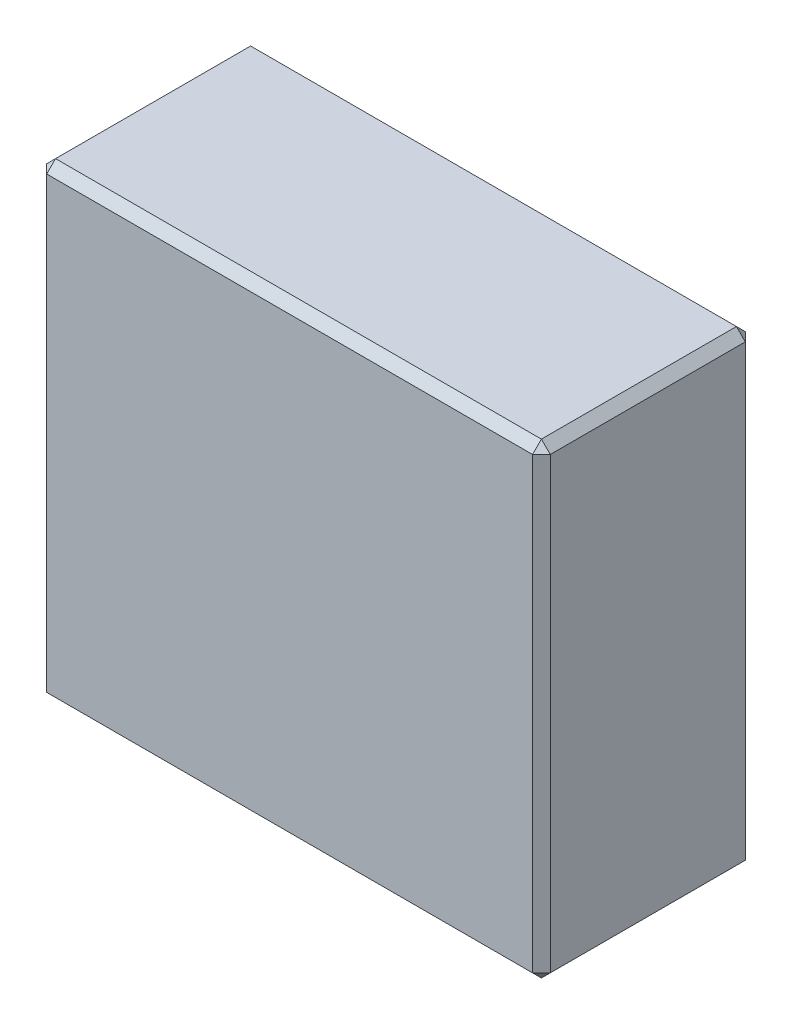
ISO-10303-21;
HEADER;
FILE_DESCRIPTION(('STEP AP214'),'2;1');
FILE_NAME('part.step','',(''),(''),'','','');
FILE_SCHEMA(('AUTOMOTIVE_DESIGN { 1 0 10303 214 1 1 1 1 }'));
ENDSEC;
DATA;
#1=APPLICATION_CONTEXT('core data for automotive mechanical design processes');
#2=APPLICATION_PROTOCOL_DEFINITION('international standard','automotive_design',2000,#1);
#3=PRODUCT_CONTEXT('',#1,'mechanical');
#4=PRODUCT('Part','Part','',(#3));
#5=PRODUCT_RELATED_PRODUCT_CATEGORY('part','',(#4));
#6=PRODUCT_DEFINITION_FORMATION('','',#4);
#7=PRODUCT_DEFINITION_CONTEXT('part definition',#1,'design');
#8=PRODUCT_DEFINITION('design','',#6,#7);
#9=PRODUCT_DEFINITION_SHAPE('','',#8);
#10=(LENGTH_UNIT() NAMED_UNIT(*) SI_UNIT(.MILLI.,.METRE.));
#11=(NAMED_UNIT(*) PLANE_ANGLE_UNIT() SI_UNIT($,.RADIAN.));
#12=(NAMED_UNIT(*) SI_UNIT($,.STERADIAN.) SOLID_ANGLE_UNIT());
#13=UNCERTAINTY_MEASURE_WITH_UNIT(LENGTH_MEASURE(1.E-05),#10,'distance_accuracy_value','');
#14=(GEOMETRIC_REPRESENTATION_CONTEXT(3) GLOBAL_UNCERTAINTY_ASSIGNED_CONTEXT((#13)) GLOBAL_UNIT_ASSIGNED_CONTEXT((#10,
#11,#12)) REPRESENTATION_CONTEXT('',''));
#15=CARTESIAN_POINT('',(0.,0.,0.));
#16=DIRECTION('',(0.,0.,1.));
#17=DIRECTION('',(1.,0.,0.));
#18=AXIS2_PLACEMENT_3D('',#15,#16,#17);
#19=CARTESIAN_POINT('',(-90.17,-83.566,38.1));
#20=DIRECTION('',(-1.,0.,0.));
#21=DIRECTION('',(0.,0.,1.));
#22=AXIS2_PLACEMENT_3D('',#19,#20,#21);
#23=PLANE('',#22);
#24=DIRECTION('',(0.,-1.,0.));
#25=VECTOR('',#24,1.);
#26=CARTESIAN_POINT('',(-90.17,-83.566,-34.9249999999999));
#27=LINE('',#26,#25);
#28=CARTESIAN_POINT('',(-90.17,80.3909999999999,-34.9249999999999));
#29=VERTEX_POINT('',#28);
#30=CARTESIAN_POINT('',(-90.17,-80.3909999999999,-34.9249999999999));
#31=VERTEX_POINT('',#30);
#32=EDGE_CURVE('E284',#29,#31,#27,.T.);
#33=ORIENTED_EDGE('',*,*,#32,.T.);
#34=DIRECTION('',(0.,0.,1.));
#35=VECTOR('',#34,1.);
#36=CARTESIAN_POINT('',(-90.17,-80.3909999999999,38.1));
#37=LINE('',#36,#35);
#38=CARTESIAN_POINT('',(-90.17,-80.3909999999999,34.9249999999999));
#39=VERTEX_POINT('',#38);
#40=EDGE_CURVE('E223',#31,#39,#37,.T.);
#41=ORIENTED_EDGE('',*,*,#40,.T.);
#42=DIRECTION('',(0.,1.,0.));
#43=VECTOR('',#42,1.);
#44=CARTESIAN_POINT('',(-90.17,-83.566,34.9249999999999));
#45=LINE('',#44,#43);
#46=CARTESIAN_POINT('',(-90.17,80.3909999999999,34.9249999999999));
#47=VERTEX_POINT('',#46);
#48=EDGE_CURVE('E213',#39,#47,#45,.T.);
#49=ORIENTED_EDGE('',*,*,#48,.T.);
#50=DIRECTION('',(0.,0.,-1.));
#51=VECTOR('',#50,1.);
#52=CARTESIAN_POINT('',(-90.17,80.3909999999999,38.1));
#53=LINE('',#52,#51);
#54=EDGE_CURVE('E281',#47,#29,#53,.T.);
#55=ORIENTED_EDGE('',*,*,#54,.T.);
#56=EDGE_LOOP('',(#33,#41,#49,#55));
#57=FACE_BOUND('',#56,.T.);
#58=ADVANCED_FACE('F36',(#57),#23,.T.);
#59=CARTESIAN_POINT('',(90.17,-83.566,-38.1));
#60=DIRECTION('',(0.,0.,-1.));
#61=DIRECTION('',(-1.,0.,0.));
#62=AXIS2_PLACEMENT_3D('',#59,#60,#61);
#63=PLANE('',#62);
#64=DIRECTION('',(0.,-1.,0.));
#65=VECTOR('',#64,1.);
#66=CARTESIAN_POINT('',(86.9949999999999,-83.566,-38.1));
#67=LINE('',#66,#65);
#68=CARTESIAN_POINT('',(86.9949999999999,80.3909999999999,-38.1));
#69=VERTEX_POINT('',#68);
#70=CARTESIAN_POINT('',(86.9949999999999,-80.3909999999999,-38.1));
#71=VERTEX_POINT('',#70);
#72=EDGE_CURVE('E155',#69,#71,#67,.T.);
#73=ORIENTED_EDGE('',*,*,#72,.T.);
#74=DIRECTION('',(-1.,0.,0.));
#75=VECTOR('',#74,1.);
#76=CARTESIAN_POINT('',(-90.17,-80.3909999999999,-38.1));
#77=LINE('',#76,#75);
#78=CARTESIAN_POINT('',(-86.9949999999999,-80.3909999999999,-38.1));
#79=VERTEX_POINT('',#78);
#80=EDGE_CURVE('E278',#71,#79,#77,.T.);
#81=ORIENTED_EDGE('',*,*,#80,.T.);
#82=DIRECTION('',(0.,1.,0.));
#83=VECTOR('',#82,1.);
#84=CARTESIAN_POINT('',(-86.9949999999999,-83.566,-38.1));
#85=LINE('',#84,#83);
#86=CARTESIAN_POINT('',(-86.9949999999999,80.3909999999999,-38.1));
#87=VERTEX_POINT('',#86);
#88=EDGE_CURVE('E271',#79,#87,#85,.T.);
#89=ORIENTED_EDGE('',*,*,#88,.T.);
#90=DIRECTION('',(1.,0.,0.));
#91=VECTOR('',#90,1.);
#92=CARTESIAN_POINT('',(90.17,80.3909999999999,-38.1));
#93=LINE('',#92,#91);
#94=EDGE_CURVE('E269',#87,#69,#93,.T.);
#95=ORIENTED_EDGE('',*,*,#94,.T.);
#96=EDGE_LOOP('',(#73,#81,#89,#95));
#97=FACE_BOUND('',#96,.T.);
#98=ADVANCED_FACE('F331',(#97),#63,.T.);
#99=CARTESIAN_POINT('',(90.17,-83.566,38.1));
#100=DIRECTION('',(1.,0.,0.));
#101=DIRECTION('',(0.,0.,-1.));
#102=AXIS2_PLACEMENT_3D('',#99,#100,#101);
#103=PLANE('',#102);
#104=DIRECTION('',(0.,-1.,0.));
#105=VECTOR('',#104,1.);
#106=CARTESIAN_POINT('',(90.17,-83.566,34.9249999999999));
#107=LINE('',#106,#105);
#108=CARTESIAN_POINT('',(90.17,80.3909999999999,34.9249999999999));
#109=VERTEX_POINT('',#108);
#110=CARTESIAN_POINT('',(90.17,-80.3909999999999,34.9249999999999));
#111=VERTEX_POINT('',#110);
#112=EDGE_CURVE('E134',#109,#111,#107,.T.);
#113=ORIENTED_EDGE('',*,*,#112,.T.);
#114=DIRECTION('',(0.,0.,-1.));
#115=VECTOR('',#114,1.);
#116=CARTESIAN_POINT('',(90.17,-80.3909999999999,-38.1));
#117=LINE('',#116,#115);
#118=CARTESIAN_POINT('',(90.17,-80.3909999999999,-34.9249999999999));
#119=VERTEX_POINT('',#118);
#120=EDGE_CURVE('E130',#111,#119,#117,.T.);
#121=ORIENTED_EDGE('',*,*,#120,.T.);
#122=DIRECTION('',(0.,1.,0.));
#123=VECTOR('',#122,1.);
#124=CARTESIAN_POINT('',(90.17,-83.566,-34.9249999999999));
#125=LINE('',#124,#123);
#126=CARTESIAN_POINT('',(90.17,80.3909999999999,-34.9249999999999));
#127=VERTEX_POINT('',#126);
#128=EDGE_CURVE('E124',#119,#127,#125,.T.);
#129=ORIENTED_EDGE('',*,*,#128,.T.);
#130=DIRECTION('',(0.,0.,1.));
#131=VECTOR('',#130,1.);
#132=CARTESIAN_POINT('',(90.17,80.3909999999999,38.1));
#133=LINE('',#132,#131);
#134=EDGE_CURVE('E127',#127,#109,#133,.T.);
#135=ORIENTED_EDGE('',*,*,#134,.T.);
#136=EDGE_LOOP('',(#113,#121,#129,#135));
#137=FACE_BOUND('',#136,.T.);
#138=ADVANCED_FACE('F126',(#137),#103,.T.);
#139=CARTESIAN_POINT('',(90.17,-83.566,38.1));
#140=DIRECTION('',(0.,0.,1.));
#141=DIRECTION('',(1.,0.,0.));
#142=AXIS2_PLACEMENT_3D('',#139,#140,#141);
#143=PLANE('',#142);
#144=DIRECTION('',(1.,0.,0.));
#145=VECTOR('',#144,1.);
#146=CARTESIAN_POINT('',(90.17,-80.3909999999999,38.1));
#147=LINE('',#146,#145);
#148=CARTESIAN_POINT('',(-86.9949999999999,-80.3909999999999,38.1));
#149=VERTEX_POINT('',#148);
#150=CARTESIAN_POINT('',(86.9949999999999,-80.3909999999999,38.1));
#151=VERTEX_POINT('',#150);
#152=EDGE_CURVE('E218',#149,#151,#147,.T.);
#153=ORIENTED_EDGE('',*,*,#152,.T.);
#154=DIRECTION('',(0.,1.,0.));
#155=VECTOR('',#154,1.);
#156=CARTESIAN_POINT('',(86.9949999999999,-83.566,38.1));
#157=LINE('',#156,#155);
#158=CARTESIAN_POINT('',(86.9949999999999,80.3909999999999,38.1));
#159=VERTEX_POINT('',#158);
#160=EDGE_CURVE('E221',#151,#159,#157,.T.);
#161=ORIENTED_EDGE('',*,*,#160,.T.);
#162=DIRECTION('',(-1.,0.,0.));
#163=VECTOR('',#162,1.);
#164=CARTESIAN_POINT('',(90.17,80.3909999999999,38.1));
#165=LINE('',#164,#163);
#166=CARTESIAN_POINT('',(-86.9949999999999,80.3909999999999,38.1));
#167=VERTEX_POINT('',#166);
#168=EDGE_CURVE('E219',#159,#167,#165,.T.);
#169=ORIENTED_EDGE('',*,*,#168,.T.);
#170=DIRECTION('',(0.,-1.,0.));
#171=VECTOR('',#170,1.);
#172=CARTESIAN_POINT('',(-86.9949999999999,-83.566,38.1));
#173=LINE('',#172,#171);
#174=EDGE_CURVE('E215',#167,#149,#173,.T.);
#175=ORIENTED_EDGE('',*,*,#174,.T.);
#176=EDGE_LOOP('',(#153,#161,#169,#175));
#177=FACE_BOUND('',#176,.T.);
#178=ADVANCED_FACE('F310',(#177),#143,.T.);
#179=CARTESIAN_POINT('',(0.,-83.566,0.));
#180=DIRECTION('',(0.,1.,0.));
#181=DIRECTION('',(0.,0.,1.));
#182=AXIS2_PLACEMENT_3D('',#179,#180,#181);
#183=PLANE('',#182);
#184=DIRECTION('',(1.,0.,0.));
#185=VECTOR('',#184,1.);
#186=CARTESIAN_POINT('',(90.17,-83.566,-34.9249999999999));
#187=LINE('',#186,#185);
#188=CARTESIAN_POINT('',(-86.9949999999999,-83.566,-34.9249999999999));
#189=VERTEX_POINT('',#188);
#190=CARTESIAN_POINT('',(86.9949999999999,-83.566,-34.9249999999999));
#191=VERTEX_POINT('',#190);
#192=EDGE_CURVE('E265',#189,#191,#187,.T.);
#193=ORIENTED_EDGE('',*,*,#192,.T.);
#194=DIRECTION('',(0.,0.,1.));
#195=VECTOR('',#194,1.);
#196=CARTESIAN_POINT('',(86.9949999999999,-83.566,38.1));
#197=LINE('',#196,#195);
#198=CARTESIAN_POINT('',(86.9949999999999,-83.566,34.9249999999999));
#199=VERTEX_POINT('',#198);
#200=EDGE_CURVE('E262',#191,#199,#197,.T.);
#201=ORIENTED_EDGE('',*,*,#200,.T.);
#202=DIRECTION('',(-1.,0.,0.));
#203=VECTOR('',#202,1.);
#204=CARTESIAN_POINT('',(-90.17,-83.566,34.9249999999999));
#205=LINE('',#204,#203);
#206=CARTESIAN_POINT('',(-86.9949999999999,-83.566,34.9249999999999));
#207=VERTEX_POINT('',#206);
#208=EDGE_CURVE('E254',#199,#207,#205,.T.);
#209=ORIENTED_EDGE('',*,*,#208,.T.);
#210=DIRECTION('',(0.,0.,-1.));
#211=VECTOR('',#210,1.);
#212=CARTESIAN_POINT('',(-86.9949999999999,-83.566,-38.1));
#213=LINE('',#212,#211);
#214=EDGE_CURVE('E259',#207,#189,#213,.T.);
#215=ORIENTED_EDGE('',*,*,#214,.T.);
#216=EDGE_LOOP('',(#193,#201,#209,#215));
#217=FACE_BOUND('',#216,.T.);
#218=ADVANCED_FACE('F263',(#217),#183,.F.);
#219=CARTESIAN_POINT('',(0.,83.566,0.));
#220=DIRECTION('',(0.,1.,0.));
#221=DIRECTION('',(0.,0.,1.));
#222=AXIS2_PLACEMENT_3D('',#219,#220,#221);
#223=PLANE('',#222);
#224=DIRECTION('',(0.,0.,-1.));
#225=VECTOR('',#224,1.);
#226=CARTESIAN_POINT('',(86.9949999999999,83.566,0.));
#227=LINE('',#226,#225);
#228=CARTESIAN_POINT('',(86.9949999999999,83.566,34.9249999999999));
#229=VERTEX_POINT('',#228);
#230=CARTESIAN_POINT('',(86.9949999999999,83.566,-34.9249999999999));
#231=VERTEX_POINT('',#230);
#232=EDGE_CURVE('E45',#229,#231,#227,.T.);
#233=ORIENTED_EDGE('',*,*,#232,.T.);
#234=DIRECTION('',(-1.,0.,0.));
#235=VECTOR('',#234,1.);
#236=CARTESIAN_POINT('',(0.,83.566,-34.9249999999999));
#237=LINE('',#236,#235);
#238=CARTESIAN_POINT('',(-86.9949999999999,83.566,-34.9249999999999));
#239=VERTEX_POINT('',#238);
#240=EDGE_CURVE('E11',#231,#239,#237,.T.);
#241=ORIENTED_EDGE('',*,*,#240,.T.);
#242=DIRECTION('',(0.,0.,1.));
#243=VECTOR('',#242,1.);
#244=CARTESIAN_POINT('',(-86.9949999999999,83.566,0.));
#245=LINE('',#244,#243);
#246=CARTESIAN_POINT('',(-86.9949999999999,83.566,34.9249999999999));
#247=VERTEX_POINT('',#246);
#248=EDGE_CURVE('E229',#239,#247,#245,.T.);
#249=ORIENTED_EDGE('',*,*,#248,.T.);
#250=DIRECTION('',(1.,0.,0.));
#251=VECTOR('',#250,1.);
#252=CARTESIAN_POINT('',(0.,83.566,34.9249999999999));
#253=LINE('',#252,#251);
#254=EDGE_CURVE('E56',#247,#229,#253,.T.);
#255=ORIENTED_EDGE('',*,*,#254,.T.);
#256=EDGE_LOOP('',(#233,#241,#249,#255));
#257=FACE_BOUND('',#256,.T.);
#258=ADVANCED_FACE('F380',(#257),#223,.T.);
#259=CARTESIAN_POINT('',(-86.9949999999999,83.566,0.));
#260=DIRECTION('',(0.707106781186551,-0.707106781186544,0.));
#261=DIRECTION('',(0.,0.,1.));
#262=AXIS2_PLACEMENT_3D('',#259,#260,#261);
#263=PLANE('',#262);
#264=DIRECTION('',(0.707106781186544,0.707106781186551,0.));
#265=VECTOR('',#264,1.);
#266=CARTESIAN_POINT('',(-90.17,80.3909999999999,34.9249999999999));
#267=LINE('',#266,#265);
#268=EDGE_CURVE('E40',#247,#47,#267,.F.);
#269=ORIENTED_EDGE('',*,*,#268,.F.);
#270=ORIENTED_EDGE('',*,*,#248,.F.);
#271=DIRECTION('',(-0.707106781186544,-0.707106781186551,0.));
#272=VECTOR('',#271,1.);
#273=CARTESIAN_POINT('',(-88.5825,81.9785,-34.9249999999999));
#274=LINE('',#273,#272);
#275=EDGE_CURVE('E193',#29,#239,#274,.F.);
#276=ORIENTED_EDGE('',*,*,#275,.F.);
#277=ORIENTED_EDGE('',*,*,#54,.F.);
#278=EDGE_LOOP('',(#269,#270,#276,#277));
#279=FACE_BOUND('',#278,.T.);
#280=ADVANCED_FACE('F38',(#279),#263,.F.);
#281=CARTESIAN_POINT('',(-90.17,80.3909999999999,34.9249999999999));
#282=DIRECTION('',(-0.577350269189631,0.577350269189621,0.577350269189626));
#283=DIRECTION('',(0.707106781186544,0.,0.707106781186551));
#284=AXIS2_PLACEMENT_3D('',#281,#282,#283);
#285=PLANE('',#284);
#286=DIRECTION('',(0.,-0.707106781186551,0.707106781186544));
#287=VECTOR('',#286,1.);
#288=CARTESIAN_POINT('',(-86.9949999999999,81.9785,36.5124999999999));
#289=LINE('',#288,#287);
#290=EDGE_CURVE('E188',#247,#167,#289,.T.);
#291=ORIENTED_EDGE('',*,*,#290,.F.);
#292=ORIENTED_EDGE('',*,*,#268,.T.);
#293=DIRECTION('',(-0.707106781186544,0.,-0.707106781186551));
#294=VECTOR('',#293,1.);
#295=CARTESIAN_POINT('',(-90.17,80.3909999999999,34.9249999999999));
#296=LINE('',#295,#294);
#297=EDGE_CURVE('E191',#167,#47,#296,.T.);
#298=ORIENTED_EDGE('',*,*,#297,.F.);
#299=EDGE_LOOP('',(#291,#292,#298));
#300=FACE_BOUND('',#299,.T.);
#301=ADVANCED_FACE('F205',(#300),#285,.T.);
#302=CARTESIAN_POINT('',(-86.9949999999999,80.3909999999999,-38.1));
#303=DIRECTION('',(-0.577350269189631,0.577350269189621,-0.577350269189626));
#304=DIRECTION('',(-0.707106781186544,0.,0.707106781186551));
#305=AXIS2_PLACEMENT_3D('',#302,#303,#304);
#306=PLANE('',#305);
#307=DIRECTION('',(0.707106781186544,0.,-0.707106781186551));
#308=VECTOR('',#307,1.);
#309=CARTESIAN_POINT('',(-86.9949999999999,80.3909999999999,-38.1));
#310=LINE('',#309,#308);
#311=EDGE_CURVE('E183',#29,#87,#310,.T.);
#312=ORIENTED_EDGE('',*,*,#311,.F.);
#313=ORIENTED_EDGE('',*,*,#275,.T.);
#314=DIRECTION('',(0.,0.707106781186551,0.707106781186544));
#315=VECTOR('',#314,1.);
#316=CARTESIAN_POINT('',(-86.9949999999999,80.3909999999999,-38.1));
#317=LINE('',#316,#315);
#318=EDGE_CURVE('E186',#87,#239,#317,.T.);
#319=ORIENTED_EDGE('',*,*,#318,.F.);
#320=EDGE_LOOP('',(#312,#313,#319));
#321=FACE_BOUND('',#320,.T.);
#322=ADVANCED_FACE('F328',(#321),#306,.T.);
#323=CARTESIAN_POINT('',(-90.17,-83.566,34.9249999999999));
#324=DIRECTION('',(0.707106781186551,0.,-0.707106781186544));
#325=DIRECTION('',(0.,1.,0.));
#326=AXIS2_PLACEMENT_3D('',#323,#324,#325);
#327=PLANE('',#326);
#328=ORIENTED_EDGE('',*,*,#297,.T.);
#329=ORIENTED_EDGE('',*,*,#48,.F.);
#330=DIRECTION('',(0.707106781186544,0.,0.707106781186551));
#331=VECTOR('',#330,1.);
#332=CARTESIAN_POINT('',(-90.17,-80.3909999999999,34.9249999999999));
#333=LINE('',#332,#331);
#334=EDGE_CURVE('E178',#149,#39,#333,.F.);
#335=ORIENTED_EDGE('',*,*,#334,.F.);
#336=ORIENTED_EDGE('',*,*,#174,.F.);
#337=EDGE_LOOP('',(#328,#329,#335,#336));
#338=FACE_BOUND('',#337,.T.);
#339=ADVANCED_FACE('F211',(#338),#327,.F.);
#340=CARTESIAN_POINT('',(0.,83.566,34.9249999999999));
#341=DIRECTION('',(0.,-0.707106781186544,-0.707106781186551));
#342=DIRECTION('',(1.,0.,0.));
#343=AXIS2_PLACEMENT_3D('',#340,#341,#342);
#344=PLANE('',#343);
#345=ORIENTED_EDGE('',*,*,#290,.T.);
#346=ORIENTED_EDGE('',*,*,#168,.F.);
#347=DIRECTION('',(0.,0.707106781186551,-0.707106781186544));
#348=VECTOR('',#347,1.);
#349=CARTESIAN_POINT('',(86.9949999999999,80.3909999999999,38.1));
#350=LINE('',#349,#348);
#351=EDGE_CURVE('E175',#229,#159,#350,.F.);
#352=ORIENTED_EDGE('',*,*,#351,.F.);
#353=ORIENTED_EDGE('',*,*,#254,.F.);
#354=EDGE_LOOP('',(#345,#346,#352,#353));
#355=FACE_BOUND('',#354,.T.);
#356=ADVANCED_FACE('F319',(#355),#344,.F.);
#357=CARTESIAN_POINT('',(86.9949999999999,83.566,0.));
#358=DIRECTION('',(-0.707106781186551,-0.707106781186544,0.));
#359=DIRECTION('',(0.,0.,-1.));
#360=AXIS2_PLACEMENT_3D('',#357,#358,#359);
#361=PLANE('',#360);
#362=DIRECTION('',(-0.707106781186544,0.707106781186551,0.));
#363=VECTOR('',#362,1.);
#364=CARTESIAN_POINT('',(90.17,80.3909999999999,-34.9249999999999));
#365=LINE('',#364,#363);
#366=EDGE_CURVE('E140',#231,#127,#365,.F.);
#367=ORIENTED_EDGE('',*,*,#366,.F.);
#368=ORIENTED_EDGE('',*,*,#232,.F.);
#369=DIRECTION('',(0.707106781186544,-0.707106781186551,0.));
#370=VECTOR('',#369,1.);
#371=CARTESIAN_POINT('',(88.5824999999999,81.9785,34.9249999999999));
#372=LINE('',#371,#370);
#373=EDGE_CURVE('E143',#109,#229,#372,.F.);
#374=ORIENTED_EDGE('',*,*,#373,.F.);
#375=ORIENTED_EDGE('',*,*,#134,.F.);
#376=EDGE_LOOP('',(#367,#368,#374,#375));
#377=FACE_BOUND('',#376,.T.);
#378=ADVANCED_FACE('F139',(#377),#361,.F.);
#379=CARTESIAN_POINT('',(0.,83.566,-34.9249999999999));
#380=DIRECTION('',(0.,-0.707106781186544,0.707106781186551));
#381=DIRECTION('',(-1.,0.,0.));
#382=AXIS2_PLACEMENT_3D('',#379,#380,#381);
#383=PLANE('',#382);
#384=ORIENTED_EDGE('',*,*,#318,.T.);
#385=ORIENTED_EDGE('',*,*,#240,.F.);
#386=DIRECTION('',(0.,-0.707106781186551,-0.707106781186544));
#387=VECTOR('',#386,1.);
#388=CARTESIAN_POINT('',(86.9949999999999,81.9785,-36.5124999999999));
#389=LINE('',#388,#387);
#390=EDGE_CURVE('E152',#69,#231,#389,.F.);
#391=ORIENTED_EDGE('',*,*,#390,.F.);
#392=ORIENTED_EDGE('',*,*,#94,.F.);
#393=EDGE_LOOP('',(#384,#385,#391,#392));
#394=FACE_BOUND('',#393,.T.);
#395=ADVANCED_FACE('F326',(#394),#383,.F.);
#396=CARTESIAN_POINT('',(-86.9949999999999,-83.566,-38.1));
#397=DIRECTION('',(0.707106781186551,0.,0.707106781186544));
#398=DIRECTION('',(0.,1.,0.));
#399=AXIS2_PLACEMENT_3D('',#396,#397,#398);
#400=PLANE('',#399);
#401=ORIENTED_EDGE('',*,*,#311,.T.);
#402=ORIENTED_EDGE('',*,*,#88,.F.);
#403=DIRECTION('',(-0.707106781186544,0.,0.707106781186551));
#404=VECTOR('',#403,1.);
#405=CARTESIAN_POINT('',(-86.9949999999999,-80.3909999999999,-38.1));
#406=LINE('',#405,#404);
#407=EDGE_CURVE('E170',#31,#79,#406,.F.);
#408=ORIENTED_EDGE('',*,*,#407,.F.);
#409=ORIENTED_EDGE('',*,*,#32,.F.);
#410=EDGE_LOOP('',(#401,#402,#408,#409));
#411=FACE_BOUND('',#410,.T.);
#412=ADVANCED_FACE('F296',(#411),#400,.F.);
#413=CARTESIAN_POINT('',(-90.17,-80.3909999999999,38.1));
#414=DIRECTION('',(-0.707106781186551,-0.707106781186544,0.));
#415=DIRECTION('',(0.,0.,-1.));
#416=AXIS2_PLACEMENT_3D('',#413,#414,#415);
#417=PLANE('',#416);
#418=DIRECTION('',(0.707106781186544,-0.707106781186551,0.));
#419=VECTOR('',#418,1.);
#420=CARTESIAN_POINT('',(-90.17,-80.3909999999999,34.9249999999999));
#421=LINE('',#420,#419);
#422=EDGE_CURVE('E180',#39,#207,#421,.T.);
#423=ORIENTED_EDGE('',*,*,#422,.F.);
#424=ORIENTED_EDGE('',*,*,#40,.F.);
#425=DIRECTION('',(-0.707106781186544,0.707106781186551,0.));
#426=VECTOR('',#425,1.);
#427=CARTESIAN_POINT('',(-88.5825,-81.9785,-34.9249999999999));
#428=LINE('',#427,#426);
#429=EDGE_CURVE('E167',#189,#31,#428,.T.);
#430=ORIENTED_EDGE('',*,*,#429,.F.);
#431=ORIENTED_EDGE('',*,*,#214,.F.);
#432=EDGE_LOOP('',(#423,#424,#430,#431));
#433=FACE_BOUND('',#432,.T.);
#434=ADVANCED_FACE('F292',(#433),#417,.T.);
#435=CARTESIAN_POINT('',(-90.17,-80.3909999999999,34.9249999999999));
#436=DIRECTION('',(-0.577350269189631,-0.577350269189626,0.577350269189621));
#437=DIRECTION('',(0.707106781186544,-0.707106781186551,0.));
#438=AXIS2_PLACEMENT_3D('',#435,#436,#437);
#439=PLANE('',#438);
#440=ORIENTED_EDGE('',*,*,#334,.T.);
#441=ORIENTED_EDGE('',*,*,#422,.T.);
#442=DIRECTION('',(0.,0.707106781186544,0.707106781186551));
#443=VECTOR('',#442,1.);
#444=CARTESIAN_POINT('',(-86.9949999999999,-81.9785,36.5124999999999));
#445=LINE('',#444,#443);
#446=EDGE_CURVE('E159',#149,#207,#445,.F.);
#447=ORIENTED_EDGE('',*,*,#446,.F.);
#448=EDGE_LOOP('',(#440,#441,#447));
#449=FACE_BOUND('',#448,.T.);
#450=ADVANCED_FACE('F308',(#449),#439,.T.);
#451=CARTESIAN_POINT('',(86.9949999999999,80.3909999999999,38.1));
#452=DIRECTION('',(0.577350269189631,0.577350269189621,0.577350269189626));
#453=DIRECTION('',(0.707106781186544,0.,-0.707106781186551));
#454=AXIS2_PLACEMENT_3D('',#451,#452,#453);
#455=PLANE('',#454);
#456=ORIENTED_EDGE('',*,*,#373,.T.);
#457=ORIENTED_EDGE('',*,*,#351,.T.);
#458=DIRECTION('',(-0.707106781186544,0.,0.707106781186551));
#459=VECTOR('',#458,1.);
#460=CARTESIAN_POINT('',(86.9949999999999,80.3909999999999,38.1));
#461=LINE('',#460,#459);
#462=EDGE_CURVE('E156',#109,#159,#461,.T.);
#463=ORIENTED_EDGE('',*,*,#462,.F.);
#464=EDGE_LOOP('',(#456,#457,#463));
#465=FACE_BOUND('',#464,.T.);
#466=ADVANCED_FACE('F317',(#465),#455,.T.);
#467=CARTESIAN_POINT('',(90.17,80.3909999999999,-34.9249999999999));
#468=DIRECTION('',(0.577350269189626,0.577350269189621,-0.577350269189631));
#469=DIRECTION('',(-0.707106781186551,0.,-0.707106781186544));
#470=AXIS2_PLACEMENT_3D('',#467,#468,#469);
#471=PLANE('',#470);
#472=ORIENTED_EDGE('',*,*,#390,.T.);
#473=ORIENTED_EDGE('',*,*,#366,.T.);
#474=DIRECTION('',(0.707106781186551,0.,0.707106781186544));
#475=VECTOR('',#474,1.);
#476=CARTESIAN_POINT('',(90.17,80.3909999999999,-34.9249999999999));
#477=LINE('',#476,#475);
#478=EDGE_CURVE('E149',#69,#127,#477,.T.);
#479=ORIENTED_EDGE('',*,*,#478,.F.);
#480=EDGE_LOOP('',(#472,#473,#479));
#481=FACE_BOUND('',#480,.T.);
#482=ADVANCED_FACE('F148',(#481),#471,.T.);
#483=CARTESIAN_POINT('',(-86.9949999999999,-80.3909999999999,-38.1));
#484=DIRECTION('',(-0.577350269189631,-0.577350269189626,-0.577350269189621));
#485=DIRECTION('',(0.707106781186544,-0.707106781186551,0.));
#486=AXIS2_PLACEMENT_3D('',#483,#484,#485);
#487=PLANE('',#486);
#488=ORIENTED_EDGE('',*,*,#429,.T.);
#489=ORIENTED_EDGE('',*,*,#407,.T.);
#490=DIRECTION('',(0.,-0.707106781186544,0.707106781186551));
#491=VECTOR('',#490,1.);
#492=CARTESIAN_POINT('',(-86.9949999999999,-80.3909999999999,-38.1));
#493=LINE('',#492,#491);
#494=EDGE_CURVE('E157',#189,#79,#493,.F.);
#495=ORIENTED_EDGE('',*,*,#494,.F.);
#496=EDGE_LOOP('',(#488,#489,#495));
#497=FACE_BOUND('',#496,.T.);
#498=ADVANCED_FACE('F298',(#497),#487,.T.);
#499=CARTESIAN_POINT('',(90.17,-80.3909999999999,38.1));
#500=DIRECTION('',(0.,-0.707106781186551,0.707106781186544));
#501=DIRECTION('',(-1.,0.,0.));
#502=AXIS2_PLACEMENT_3D('',#499,#500,#501);
#503=PLANE('',#502);
#504=ORIENTED_EDGE('',*,*,#446,.T.);
#505=ORIENTED_EDGE('',*,*,#208,.F.);
#506=DIRECTION('',(0.,-0.707106781186544,-0.707106781186551));
#507=VECTOR('',#506,1.);
#508=CARTESIAN_POINT('',(86.9949999999999,-83.566,34.9249999999999));
#509=LINE('',#508,#507);
#510=EDGE_CURVE('E161',#151,#199,#509,.T.);
#511=ORIENTED_EDGE('',*,*,#510,.F.);
#512=ORIENTED_EDGE('',*,*,#152,.F.);
#513=EDGE_LOOP('',(#504,#505,#511,#512));
#514=FACE_BOUND('',#513,.T.);
#515=ADVANCED_FACE('F256',(#514),#503,.T.);
#516=CARTESIAN_POINT('',(86.9949999999999,-83.566,38.1));
#517=DIRECTION('',(-0.707106781186551,0.,-0.707106781186544));
#518=DIRECTION('',(0.,1.,0.));
#519=AXIS2_PLACEMENT_3D('',#516,#517,#518);
#520=PLANE('',#519);
#521=ORIENTED_EDGE('',*,*,#462,.T.);
#522=ORIENTED_EDGE('',*,*,#160,.F.);
#523=DIRECTION('',(0.707106781186544,0.,-0.707106781186551));
#524=VECTOR('',#523,1.);
#525=CARTESIAN_POINT('',(88.5824999999999,-80.3909999999999,36.5124999999999));
#526=LINE('',#525,#524);
#527=EDGE_CURVE('E243',#111,#151,#526,.F.);
#528=ORIENTED_EDGE('',*,*,#527,.F.);
#529=ORIENTED_EDGE('',*,*,#112,.F.);
#530=EDGE_LOOP('',(#521,#522,#528,#529));
#531=FACE_BOUND('',#530,.T.);
#532=ADVANCED_FACE('F312',(#531),#520,.F.);
#533=CARTESIAN_POINT('',(90.17,-83.566,-34.9249999999999));
#534=DIRECTION('',(-0.707106781186544,0.,0.707106781186551));
#535=DIRECTION('',(0.,1.,0.));
#536=AXIS2_PLACEMENT_3D('',#533,#534,#535);
#537=PLANE('',#536);
#538=ORIENTED_EDGE('',*,*,#478,.T.);
#539=ORIENTED_EDGE('',*,*,#128,.F.);
#540=DIRECTION('',(-0.707106781186551,0.,-0.707106781186544));
#541=VECTOR('',#540,1.);
#542=CARTESIAN_POINT('',(90.17,-80.3909999999999,-34.9249999999999));
#543=LINE('',#542,#541);
#544=EDGE_CURVE('E240',#71,#119,#543,.F.);
#545=ORIENTED_EDGE('',*,*,#544,.F.);
#546=ORIENTED_EDGE('',*,*,#72,.F.);
#547=EDGE_LOOP('',(#538,#539,#545,#546));
#548=FACE_BOUND('',#547,.T.);
#549=ADVANCED_FACE('F154',(#548),#537,.F.);
#550=CARTESIAN_POINT('',(90.17,-80.3909999999999,-38.1));
#551=DIRECTION('',(0.,-0.707106781186551,-0.707106781186544));
#552=DIRECTION('',(1.,0.,0.));
#553=AXIS2_PLACEMENT_3D('',#550,#551,#552);
#554=PLANE('',#553);
#555=ORIENTED_EDGE('',*,*,#494,.T.);
#556=ORIENTED_EDGE('',*,*,#80,.F.);
#557=DIRECTION('',(0.,0.707106781186544,-0.707106781186551));
#558=VECTOR('',#557,1.);
#559=CARTESIAN_POINT('',(86.9949999999999,-81.9785,-36.5124999999999));
#560=LINE('',#559,#558);
#561=EDGE_CURVE('E237',#191,#71,#560,.T.);
#562=ORIENTED_EDGE('',*,*,#561,.F.);
#563=ORIENTED_EDGE('',*,*,#192,.F.);
#564=EDGE_LOOP('',(#555,#556,#562,#563));
#565=FACE_BOUND('',#564,.T.);
#566=ADVANCED_FACE('F301',(#565),#554,.T.);
#567=CARTESIAN_POINT('',(86.9949999999999,-83.566,34.9249999999999));
#568=DIRECTION('',(0.577350269189626,-0.577350269189631,0.577350269189621));
#569=DIRECTION('',(0.707106781186551,0.707106781186544,0.));
#570=AXIS2_PLACEMENT_3D('',#567,#568,#569);
#571=PLANE('',#570);
#572=ORIENTED_EDGE('',*,*,#527,.T.);
#573=ORIENTED_EDGE('',*,*,#510,.T.);
#574=DIRECTION('',(0.707106781186551,0.707106781186544,0.));
#575=VECTOR('',#574,1.);
#576=CARTESIAN_POINT('',(86.9949999999999,-83.566,34.9249999999999));
#577=LINE('',#576,#575);
#578=EDGE_CURVE('E235',#111,#199,#577,.F.);
#579=ORIENTED_EDGE('',*,*,#578,.F.);
#580=EDGE_LOOP('',(#572,#573,#579));
#581=FACE_BOUND('',#580,.T.);
#582=ADVANCED_FACE('F250',(#581),#571,.T.);
#583=CARTESIAN_POINT('',(90.17,-80.3909999999999,-34.9249999999999));
#584=DIRECTION('',(0.577350269189621,-0.577350269189631,-0.577350269189626));
#585=DIRECTION('',(0.,0.707106781186544,-0.707106781186551));
#586=AXIS2_PLACEMENT_3D('',#583,#584,#585);
#587=PLANE('',#586);
#588=ORIENTED_EDGE('',*,*,#561,.T.);
#589=ORIENTED_EDGE('',*,*,#544,.T.);
#590=DIRECTION('',(-0.707106781186551,-0.707106781186544,0.));
#591=VECTOR('',#590,1.);
#592=CARTESIAN_POINT('',(90.17,-80.3909999999999,-34.9249999999999));
#593=LINE('',#592,#591);
#594=EDGE_CURVE('E233',#191,#119,#593,.F.);
#595=ORIENTED_EDGE('',*,*,#594,.F.);
#596=EDGE_LOOP('',(#588,#589,#595));
#597=FACE_BOUND('',#596,.T.);
#598=ADVANCED_FACE('F303',(#597),#587,.T.);
#599=CARTESIAN_POINT('',(90.17,-80.3909999999999,38.1));
#600=DIRECTION('',(0.707106781186544,-0.707106781186551,0.));
#601=DIRECTION('',(0.,0.,1.));
#602=AXIS2_PLACEMENT_3D('',#599,#600,#601);
#603=PLANE('',#602);
#604=ORIENTED_EDGE('',*,*,#578,.T.);
#605=ORIENTED_EDGE('',*,*,#200,.F.);
#606=ORIENTED_EDGE('',*,*,#594,.T.);
#607=ORIENTED_EDGE('',*,*,#120,.F.);
#608=EDGE_LOOP('',(#604,#605,#606,#607));
#609=FACE_BOUND('',#608,.T.);
#610=ADVANCED_FACE('F304',(#609),#603,.T.);
#611=CLOSED_SHELL('',(#58,#98,#138,#178,#218,#258,#280,#301,#322,#339,#356,#378,#395,#412,#434,
#450,#466,#482,#498,#515,#532,#549,#566,#582,#598,#610));
#612=MANIFOLD_SOLID_BREP('B2',#611);
#613=ADVANCED_BREP_SHAPE_REPRESENTATION('',(#18,#612),#14);
#614=SHAPE_DEFINITION_REPRESENTATION(#9,#613);
ENDSEC;
END-ISO-10303-21;
